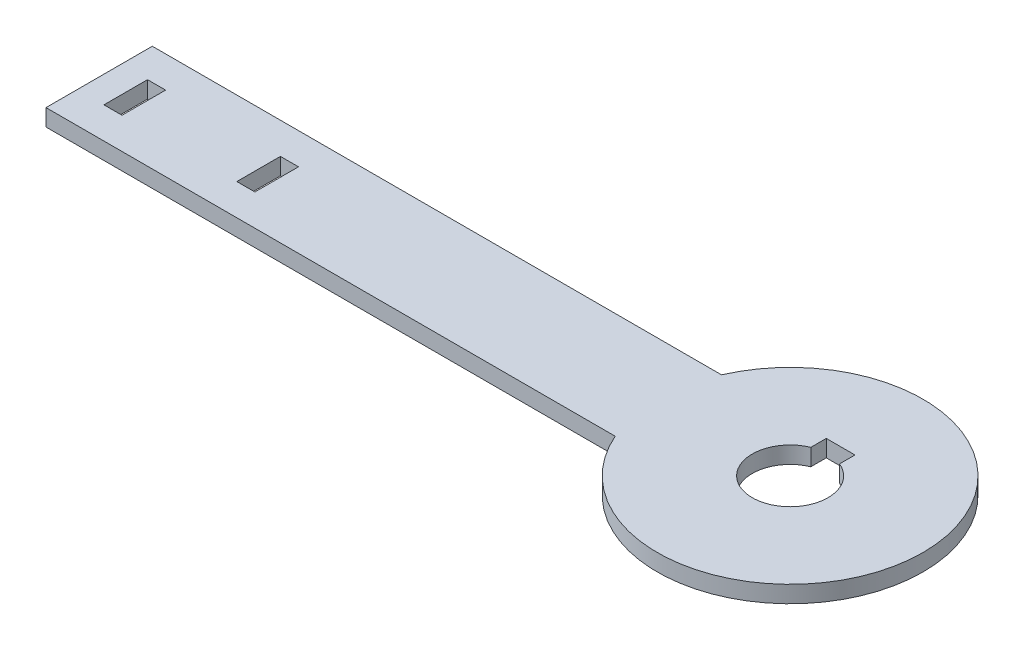
ISO-10303-21;
HEADER;
FILE_DESCRIPTION(('STEP AP214'),'2;1');
FILE_NAME('part.step','',(''),(''),'','','');
FILE_SCHEMA(('AUTOMOTIVE_DESIGN { 1 0 10303 214 1 1 1 1 }'));
ENDSEC;
DATA;
#1=APPLICATION_CONTEXT('core data for automotive mechanical design processes');
#2=APPLICATION_PROTOCOL_DEFINITION('international standard','automotive_design',2000,#1);
#3=PRODUCT_CONTEXT('',#1,'mechanical');
#4=PRODUCT('Part','Part','',(#3));
#5=PRODUCT_RELATED_PRODUCT_CATEGORY('part','',(#4));
#6=PRODUCT_DEFINITION_FORMATION('','',#4);
#7=PRODUCT_DEFINITION_CONTEXT('part definition',#1,'design');
#8=PRODUCT_DEFINITION('design','',#6,#7);
#9=PRODUCT_DEFINITION_SHAPE('','',#8);
#10=(LENGTH_UNIT() NAMED_UNIT(*) SI_UNIT(.MILLI.,.METRE.));
#11=(NAMED_UNIT(*) PLANE_ANGLE_UNIT() SI_UNIT($,.RADIAN.));
#12=(NAMED_UNIT(*) SI_UNIT($,.STERADIAN.) SOLID_ANGLE_UNIT());
#13=UNCERTAINTY_MEASURE_WITH_UNIT(LENGTH_MEASURE(1.E-05),#10,'distance_accuracy_value','');
#14=(GEOMETRIC_REPRESENTATION_CONTEXT(3) GLOBAL_UNCERTAINTY_ASSIGNED_CONTEXT((#13)) GLOBAL_UNIT_ASSIGNED_CONTEXT((#10,
#11,#12)) REPRESENTATION_CONTEXT('',''));
#15=CARTESIAN_POINT('',(0.,0.,0.));
#16=DIRECTION('',(0.,0.,1.));
#17=DIRECTION('',(1.,0.,0.));
#18=AXIS2_PLACEMENT_3D('',#15,#16,#17);
#19=CARTESIAN_POINT('',(0.,3.175,0.));
#20=DIRECTION('',(0.,-1.,0.));
#21=DIRECTION('',(0.,0.,-1.));
#22=AXIS2_PLACEMENT_3D('',#19,#20,#21);
#23=CYLINDRICAL_SURFACE('',#22,7.125);
#24=CARTESIAN_POINT('',(0.,0.,0.));
#25=DIRECTION('',(0.,1.,0.));
#26=DIRECTION('',(0.,0.,1.));
#27=AXIS2_PLACEMENT_3D('',#24,#25,#26);
#28=CIRCLE('',#27,7.125);
#29=CARTESIAN_POINT('',(-2.7,0.,-6.59360485622243));
#30=VERTEX_POINT('',#29);
#31=CARTESIAN_POINT('',(2.7,0.,-6.59360485622243));
#32=VERTEX_POINT('',#31);
#33=EDGE_CURVE('E250',#30,#32,#28,.T.);
#34=ORIENTED_EDGE('',*,*,#33,.F.);
#35=DIRECTION('',(0.,-1.,0.));
#36=VECTOR('',#35,1.);
#37=CARTESIAN_POINT('',(-2.7,3.175,-6.59360485622243));
#38=LINE('',#37,#36);
#39=CARTESIAN_POINT('',(-2.7,3.175,-6.59360485622243));
#40=VERTEX_POINT('',#39);
#41=EDGE_CURVE('E11',#40,#30,#38,.T.);
#42=ORIENTED_EDGE('',*,*,#41,.F.);
#43=CARTESIAN_POINT('',(0.,3.175,0.));
#44=DIRECTION('',(0.,1.,0.));
#45=DIRECTION('',(0.,0.,1.));
#46=AXIS2_PLACEMENT_3D('',#43,#44,#45);
#47=CIRCLE('',#46,7.125);
#48=CARTESIAN_POINT('',(2.7,3.175,-6.59360485622243));
#49=VERTEX_POINT('',#48);
#50=EDGE_CURVE('E170',#40,#49,#47,.T.);
#51=ORIENTED_EDGE('',*,*,#50,.T.);
#52=DIRECTION('',(0.,-1.,0.));
#53=VECTOR('',#52,1.);
#54=CARTESIAN_POINT('',(2.7,3.175,-6.59360485622243));
#55=LINE('',#54,#53);
#56=EDGE_CURVE('E111',#49,#32,#55,.T.);
#57=ORIENTED_EDGE('',*,*,#56,.T.);
#58=EDGE_LOOP('',(#34,#42,#51,#57));
#59=FACE_BOUND('',#58,.T.);
#60=ADVANCED_FACE('F34',(#59),#23,.F.);
#61=CARTESIAN_POINT('',(-2.7,3.175,0.));
#62=DIRECTION('',(-1.,0.,0.));
#63=DIRECTION('',(0.,0.,1.));
#64=AXIS2_PLACEMENT_3D('',#61,#62,#63);
#65=PLANE('',#64);
#66=DIRECTION('',(0.,0.,-1.));
#67=VECTOR('',#66,1.);
#68=CARTESIAN_POINT('',(-2.7,0.,0.));
#69=LINE('',#68,#67);
#70=CARTESIAN_POINT('',(-2.7,0.,-9.5));
#71=VERTEX_POINT('',#70);
#72=EDGE_CURVE('E175',#30,#71,#69,.T.);
#73=ORIENTED_EDGE('',*,*,#72,.T.);
#74=DIRECTION('',(0.,-1.,0.));
#75=VECTOR('',#74,1.);
#76=CARTESIAN_POINT('',(-2.7,3.175,-9.5));
#77=LINE('',#76,#75);
#78=CARTESIAN_POINT('',(-2.7,3.175,-9.5));
#79=VERTEX_POINT('',#78);
#80=EDGE_CURVE('E44',#79,#71,#77,.T.);
#81=ORIENTED_EDGE('',*,*,#80,.F.);
#82=DIRECTION('',(0.,0.,-1.));
#83=VECTOR('',#82,1.);
#84=CARTESIAN_POINT('',(-2.7,3.175,0.));
#85=LINE('',#84,#83);
#86=EDGE_CURVE('E166',#40,#79,#85,.T.);
#87=ORIENTED_EDGE('',*,*,#86,.F.);
#88=ORIENTED_EDGE('',*,*,#41,.T.);
#89=EDGE_LOOP('',(#73,#81,#87,#88));
#90=FACE_BOUND('',#89,.T.);
#91=ADVANCED_FACE('F173',(#90),#65,.F.);
#92=CARTESIAN_POINT('',(0.,3.175,-9.5));
#93=DIRECTION('',(0.,0.,-1.));
#94=DIRECTION('',(-1.,0.,0.));
#95=AXIS2_PLACEMENT_3D('',#92,#93,#94);
#96=PLANE('',#95);
#97=DIRECTION('',(1.,0.,0.));
#98=VECTOR('',#97,1.);
#99=CARTESIAN_POINT('',(0.,0.,-9.5));
#100=LINE('',#99,#98);
#101=CARTESIAN_POINT('',(2.7,0.,-9.5));
#102=VERTEX_POINT('',#101);
#103=EDGE_CURVE('E253',#71,#102,#100,.T.);
#104=ORIENTED_EDGE('',*,*,#103,.T.);
#105=DIRECTION('',(0.,-1.,0.));
#106=VECTOR('',#105,1.);
#107=CARTESIAN_POINT('',(2.7,3.175,-9.5));
#108=LINE('',#107,#106);
#109=CARTESIAN_POINT('',(2.7,3.175,-9.5));
#110=VERTEX_POINT('',#109);
#111=EDGE_CURVE('E165',#110,#102,#108,.T.);
#112=ORIENTED_EDGE('',*,*,#111,.F.);
#113=DIRECTION('',(1.,0.,0.));
#114=VECTOR('',#113,1.);
#115=CARTESIAN_POINT('',(0.,3.175,-9.5));
#116=LINE('',#115,#114);
#117=EDGE_CURVE('E159',#79,#110,#116,.T.);
#118=ORIENTED_EDGE('',*,*,#117,.F.);
#119=ORIENTED_EDGE('',*,*,#80,.T.);
#120=EDGE_LOOP('',(#104,#112,#118,#119));
#121=FACE_BOUND('',#120,.T.);
#122=ADVANCED_FACE('F162',(#121),#96,.F.);
#123=CARTESIAN_POINT('',(0.,3.175,-4.09999999999997));
#124=DIRECTION('',(0.,0.,1.));
#125=DIRECTION('',(1.,0.,0.));
#126=AXIS2_PLACEMENT_3D('',#123,#124,#125);
#127=PLANE('',#126);
#128=DIRECTION('',(-1.,0.,0.));
#129=VECTOR('',#128,1.);
#130=CARTESIAN_POINT('',(0.,0.,-4.09999999999997));
#131=LINE('',#130,#129);
#132=CARTESIAN_POINT('',(-96.6,0.,-4.09999999999999));
#133=VERTEX_POINT('',#132);
#134=CARTESIAN_POINT('',(-100.,0.,-4.09999999999999));
#135=VERTEX_POINT('',#134);
#136=EDGE_CURVE('E238',#133,#135,#131,.T.);
#137=ORIENTED_EDGE('',*,*,#136,.F.);
#138=DIRECTION('',(0.,-1.,0.));
#139=VECTOR('',#138,1.);
#140=CARTESIAN_POINT('',(-96.6,3.175,-4.09999999999999));
#141=LINE('',#140,#139);
#142=CARTESIAN_POINT('',(-96.6,3.175,-4.09999999999999));
#143=VERTEX_POINT('',#142);
#144=EDGE_CURVE('E187',#143,#133,#141,.T.);
#145=ORIENTED_EDGE('',*,*,#144,.F.);
#146=DIRECTION('',(-1.,0.,0.));
#147=VECTOR('',#146,1.);
#148=CARTESIAN_POINT('',(0.,3.175,-4.09999999999997));
#149=LINE('',#148,#147);
#150=CARTESIAN_POINT('',(-100.,3.175,-4.09999999999999));
#151=VERTEX_POINT('',#150);
#152=EDGE_CURVE('E275',#143,#151,#149,.T.);
#153=ORIENTED_EDGE('',*,*,#152,.T.);
#154=DIRECTION('',(0.,-1.,0.));
#155=VECTOR('',#154,1.);
#156=CARTESIAN_POINT('',(-100.,3.175,-4.09999999999999));
#157=LINE('',#156,#155);
#158=EDGE_CURVE('E180',#151,#135,#157,.T.);
#159=ORIENTED_EDGE('',*,*,#158,.T.);
#160=EDGE_LOOP('',(#137,#145,#153,#159));
#161=FACE_BOUND('',#160,.T.);
#162=ADVANCED_FACE('F319',(#161),#127,.T.);
#163=CARTESIAN_POINT('',(-96.6,3.175,0.));
#164=DIRECTION('',(-1.,0.,0.));
#165=DIRECTION('',(0.,0.,1.));
#166=AXIS2_PLACEMENT_3D('',#163,#164,#165);
#167=PLANE('',#166);
#168=DIRECTION('',(0.,0.,-1.));
#169=VECTOR('',#168,1.);
#170=CARTESIAN_POINT('',(-96.6,0.,0.));
#171=LINE('',#170,#169);
#172=CARTESIAN_POINT('',(-96.6,0.,4.10000000000001));
#173=VERTEX_POINT('',#172);
#174=EDGE_CURVE('E241',#173,#133,#171,.T.);
#175=ORIENTED_EDGE('',*,*,#174,.F.);
#176=DIRECTION('',(0.,-1.,0.));
#177=VECTOR('',#176,1.);
#178=CARTESIAN_POINT('',(-96.6,3.175,4.10000000000001));
#179=LINE('',#178,#177);
#180=CARTESIAN_POINT('',(-96.6,3.175,4.10000000000001));
#181=VERTEX_POINT('',#180);
#182=EDGE_CURVE('E185',#181,#173,#179,.T.);
#183=ORIENTED_EDGE('',*,*,#182,.F.);
#184=DIRECTION('',(0.,0.,-1.));
#185=VECTOR('',#184,1.);
#186=CARTESIAN_POINT('',(-96.6,3.175,0.));
#187=LINE('',#186,#185);
#188=EDGE_CURVE('E278',#181,#143,#187,.T.);
#189=ORIENTED_EDGE('',*,*,#188,.T.);
#190=ORIENTED_EDGE('',*,*,#144,.T.);
#191=EDGE_LOOP('',(#175,#183,#189,#190));
#192=FACE_BOUND('',#191,.T.);
#193=ADVANCED_FACE('F315',(#192),#167,.T.);
#194=CARTESIAN_POINT('',(0.,3.175,4.09999999999993));
#195=DIRECTION('',(0.,0.,-1.));
#196=DIRECTION('',(-1.,0.,0.));
#197=AXIS2_PLACEMENT_3D('',#194,#195,#196);
#198=PLANE('',#197);
#199=DIRECTION('',(1.,0.,0.));
#200=VECTOR('',#199,1.);
#201=CARTESIAN_POINT('',(0.,0.,4.09999999999993));
#202=LINE('',#201,#200);
#203=CARTESIAN_POINT('',(-100.,0.,4.10000000000001));
#204=VERTEX_POINT('',#203);
#205=EDGE_CURVE('E244',#204,#173,#202,.T.);
#206=ORIENTED_EDGE('',*,*,#205,.F.);
#207=DIRECTION('',(0.,-1.,0.));
#208=VECTOR('',#207,1.);
#209=CARTESIAN_POINT('',(-100.,3.175,4.10000000000001));
#210=LINE('',#209,#208);
#211=CARTESIAN_POINT('',(-100.,3.175,4.10000000000001));
#212=VERTEX_POINT('',#211);
#213=EDGE_CURVE('E182',#212,#204,#210,.T.);
#214=ORIENTED_EDGE('',*,*,#213,.F.);
#215=DIRECTION('',(1.,0.,0.));
#216=VECTOR('',#215,1.);
#217=CARTESIAN_POINT('',(0.,3.175,4.09999999999993));
#218=LINE('',#217,#216);
#219=EDGE_CURVE('E281',#212,#181,#218,.T.);
#220=ORIENTED_EDGE('',*,*,#219,.T.);
#221=ORIENTED_EDGE('',*,*,#182,.T.);
#222=EDGE_LOOP('',(#206,#214,#220,#221));
#223=FACE_BOUND('',#222,.T.);
#224=ADVANCED_FACE('F311',(#223),#198,.T.);
#225=CARTESIAN_POINT('',(-121.6,3.175,0.));
#226=DIRECTION('',(1.,0.,0.));
#227=DIRECTION('',(0.,0.,-1.));
#228=AXIS2_PLACEMENT_3D('',#225,#226,#227);
#229=PLANE('',#228);
#230=DIRECTION('',(0.,0.,1.));
#231=VECTOR('',#230,1.);
#232=CARTESIAN_POINT('',(-121.6,0.,0.));
#233=LINE('',#232,#231);
#234=CARTESIAN_POINT('',(-121.6,0.,-4.09999999999999));
#235=VERTEX_POINT('',#234);
#236=CARTESIAN_POINT('',(-121.6,0.,4.10000000000001));
#237=VERTEX_POINT('',#236);
#238=EDGE_CURVE('E227',#235,#237,#233,.T.);
#239=ORIENTED_EDGE('',*,*,#238,.T.);
#240=DIRECTION('',(0.,-1.,0.));
#241=VECTOR('',#240,1.);
#242=CARTESIAN_POINT('',(-121.6,3.175,4.10000000000001));
#243=LINE('',#242,#241);
#244=CARTESIAN_POINT('',(-121.6,3.175,4.10000000000001));
#245=VERTEX_POINT('',#244);
#246=EDGE_CURVE('E183',#245,#237,#243,.T.);
#247=ORIENTED_EDGE('',*,*,#246,.F.);
#248=DIRECTION('',(0.,0.,1.));
#249=VECTOR('',#248,1.);
#250=CARTESIAN_POINT('',(-121.6,3.175,0.));
#251=LINE('',#250,#249);
#252=CARTESIAN_POINT('',(-121.6,3.175,-4.09999999999999));
#253=VERTEX_POINT('',#252);
#254=EDGE_CURVE('E265',#253,#245,#251,.T.);
#255=ORIENTED_EDGE('',*,*,#254,.F.);
#256=DIRECTION('',(0.,-1.,0.));
#257=VECTOR('',#256,1.);
#258=CARTESIAN_POINT('',(-121.6,3.175,-4.09999999999999));
#259=LINE('',#258,#257);
#260=EDGE_CURVE('E189',#253,#235,#259,.T.);
#261=ORIENTED_EDGE('',*,*,#260,.T.);
#262=EDGE_LOOP('',(#239,#247,#255,#261));
#263=FACE_BOUND('',#262,.T.);
#264=ADVANCED_FACE('F314',(#263),#229,.F.);
#265=CARTESIAN_POINT('',(0.,3.175,4.10000000000004));
#266=DIRECTION('',(0.,0.,1.));
#267=DIRECTION('',(1.,0.,0.));
#268=AXIS2_PLACEMENT_3D('',#265,#266,#267);
#269=PLANE('',#268);
#270=DIRECTION('',(-1.,0.,0.));
#271=VECTOR('',#270,1.);
#272=CARTESIAN_POINT('',(0.,0.,4.10000000000004));
#273=LINE('',#272,#271);
#274=CARTESIAN_POINT('',(-125.,0.,4.10000000000001));
#275=VERTEX_POINT('',#274);
#276=EDGE_CURVE('E230',#237,#275,#273,.T.);
#277=ORIENTED_EDGE('',*,*,#276,.T.);
#278=DIRECTION('',(0.,-1.,0.));
#279=VECTOR('',#278,1.);
#280=CARTESIAN_POINT('',(-125.,3.175,4.10000000000001));
#281=LINE('',#280,#279);
#282=CARTESIAN_POINT('',(-125.,3.175,4.10000000000001));
#283=VERTEX_POINT('',#282);
#284=EDGE_CURVE('E194',#283,#275,#281,.T.);
#285=ORIENTED_EDGE('',*,*,#284,.F.);
#286=DIRECTION('',(-1.,0.,0.));
#287=VECTOR('',#286,1.);
#288=CARTESIAN_POINT('',(0.,3.175,4.10000000000004));
#289=LINE('',#288,#287);
#290=EDGE_CURVE('E268',#245,#283,#289,.T.);
#291=ORIENTED_EDGE('',*,*,#290,.F.);
#292=ORIENTED_EDGE('',*,*,#246,.T.);
#293=EDGE_LOOP('',(#277,#285,#291,#292));
#294=FACE_BOUND('',#293,.T.);
#295=ADVANCED_FACE('F331',(#294),#269,.F.);
#296=CARTESIAN_POINT('',(-125.,3.175,0.));
#297=DIRECTION('',(1.,0.,0.));
#298=DIRECTION('',(0.,0.,-1.));
#299=AXIS2_PLACEMENT_3D('',#296,#297,#298);
#300=PLANE('',#299);
#301=DIRECTION('',(0.,0.,1.));
#302=VECTOR('',#301,1.);
#303=CARTESIAN_POINT('',(-125.,0.,0.));
#304=LINE('',#303,#302);
#305=CARTESIAN_POINT('',(-125.,0.,-4.09999999999999));
#306=VERTEX_POINT('',#305);
#307=EDGE_CURVE('E233',#306,#275,#304,.T.);
#308=ORIENTED_EDGE('',*,*,#307,.F.);
#309=DIRECTION('',(0.,-1.,0.));
#310=VECTOR('',#309,1.);
#311=CARTESIAN_POINT('',(-125.,3.175,-4.09999999999999));
#312=LINE('',#311,#310);
#313=CARTESIAN_POINT('',(-125.,3.175,-4.09999999999999));
#314=VERTEX_POINT('',#313);
#315=EDGE_CURVE('E192',#314,#306,#312,.T.);
#316=ORIENTED_EDGE('',*,*,#315,.F.);
#317=DIRECTION('',(0.,0.,1.));
#318=VECTOR('',#317,1.);
#319=CARTESIAN_POINT('',(-125.,3.175,0.));
#320=LINE('',#319,#318);
#321=EDGE_CURVE('E270',#314,#283,#320,.T.);
#322=ORIENTED_EDGE('',*,*,#321,.T.);
#323=ORIENTED_EDGE('',*,*,#284,.T.);
#324=EDGE_LOOP('',(#308,#316,#322,#323));
#325=FACE_BOUND('',#324,.T.);
#326=ADVANCED_FACE('F328',(#325),#300,.T.);
#327=CARTESIAN_POINT('',(0.,3.175,10.));
#328=DIRECTION('',(0.,0.,-1.));
#329=DIRECTION('',(-1.,0.,0.));
#330=AXIS2_PLACEMENT_3D('',#327,#328,#329);
#331=PLANE('',#330);
#332=DIRECTION('',(1.,0.,0.));
#333=VECTOR('',#332,1.);
#334=CARTESIAN_POINT('',(0.,0.,10.));
#335=LINE('',#334,#333);
#336=CARTESIAN_POINT('',(-130.,0.,10.));
#337=VERTEX_POINT('',#336);
#338=CARTESIAN_POINT('',(-22.9128784747792,0.,10.));
#339=VERTEX_POINT('',#338);
#340=EDGE_CURVE('E215',#337,#339,#335,.T.);
#341=ORIENTED_EDGE('',*,*,#340,.T.);
#342=DIRECTION('',(0.,-1.,0.));
#343=VECTOR('',#342,1.);
#344=CARTESIAN_POINT('',(-22.9128784747792,3.175,10.));
#345=LINE('',#344,#343);
#346=CARTESIAN_POINT('',(-22.9128784747792,3.175,10.));
#347=VERTEX_POINT('',#346);
#348=EDGE_CURVE('E38',#347,#339,#345,.T.);
#349=ORIENTED_EDGE('',*,*,#348,.F.);
#350=DIRECTION('',(1.,0.,0.));
#351=VECTOR('',#350,1.);
#352=CARTESIAN_POINT('',(0.,3.175,10.));
#353=LINE('',#352,#351);
#354=CARTESIAN_POINT('',(-130.,3.175,10.));
#355=VERTEX_POINT('',#354);
#356=EDGE_CURVE('E255',#355,#347,#353,.T.);
#357=ORIENTED_EDGE('',*,*,#356,.F.);
#358=DIRECTION('',(0.,-1.,0.));
#359=VECTOR('',#358,1.);
#360=CARTESIAN_POINT('',(-130.,3.175,10.));
#361=LINE('',#360,#359);
#362=EDGE_CURVE('E198',#355,#337,#361,.T.);
#363=ORIENTED_EDGE('',*,*,#362,.T.);
#364=EDGE_LOOP('',(#341,#349,#357,#363));
#365=FACE_BOUND('',#364,.T.);
#366=ADVANCED_FACE('F36',(#365),#331,.F.);
#367=CARTESIAN_POINT('',(0.,3.175,0.));
#368=DIRECTION('',(0.,-1.,0.));
#369=DIRECTION('',(0.,0.,-1.));
#370=AXIS2_PLACEMENT_3D('',#367,#368,#369);
#371=CYLINDRICAL_SURFACE('',#370,25.);
#372=CARTESIAN_POINT('',(0.,0.,0.));
#373=DIRECTION('',(0.,1.,0.));
#374=DIRECTION('',(0.,0.,1.));
#375=AXIS2_PLACEMENT_3D('',#372,#373,#374);
#376=CIRCLE('',#375,25.);
#377=CARTESIAN_POINT('',(-22.9128784747792,0.,-10.));
#378=VERTEX_POINT('',#377);
#379=EDGE_CURVE('E211',#339,#378,#376,.T.);
#380=ORIENTED_EDGE('',*,*,#379,.T.);
#381=DIRECTION('',(0.,-1.,0.));
#382=VECTOR('',#381,1.);
#383=CARTESIAN_POINT('',(-22.9128784747792,3.175,-10.));
#384=LINE('',#383,#382);
#385=CARTESIAN_POINT('',(-22.9128784747792,3.175,-10.));
#386=VERTEX_POINT('',#385);
#387=EDGE_CURVE('E203',#386,#378,#384,.T.);
#388=ORIENTED_EDGE('',*,*,#387,.F.);
#389=CARTESIAN_POINT('',(0.,3.175,0.));
#390=DIRECTION('',(0.,1.,0.));
#391=DIRECTION('',(0.,0.,1.));
#392=AXIS2_PLACEMENT_3D('',#389,#390,#391);
#393=CIRCLE('',#392,25.);
#394=EDGE_CURVE('E119',#347,#386,#393,.T.);
#395=ORIENTED_EDGE('',*,*,#394,.F.);
#396=ORIENTED_EDGE('',*,*,#348,.T.);
#397=EDGE_LOOP('',(#380,#388,#395,#396));
#398=FACE_BOUND('',#397,.T.);
#399=ADVANCED_FACE('F210',(#398),#371,.T.);
#400=CARTESIAN_POINT('',(0.,3.175,-10.));
#401=DIRECTION('',(0.,0.,1.));
#402=DIRECTION('',(1.,0.,0.));
#403=AXIS2_PLACEMENT_3D('',#400,#401,#402);
#404=PLANE('',#403);
#405=DIRECTION('',(-1.,0.,0.));
#406=VECTOR('',#405,1.);
#407=CARTESIAN_POINT('',(0.,0.,-10.));
#408=LINE('',#407,#406);
#409=CARTESIAN_POINT('',(-130.,0.,-9.99999999999998));
#410=VERTEX_POINT('',#409);
#411=EDGE_CURVE('E220',#378,#410,#408,.T.);
#412=ORIENTED_EDGE('',*,*,#411,.T.);
#413=DIRECTION('',(0.,-1.,0.));
#414=VECTOR('',#413,1.);
#415=CARTESIAN_POINT('',(-130.,3.175,-9.99999999999998));
#416=LINE('',#415,#414);
#417=CARTESIAN_POINT('',(-130.,3.175,-9.99999999999998));
#418=VERTEX_POINT('',#417);
#419=EDGE_CURVE('E201',#418,#410,#416,.T.);
#420=ORIENTED_EDGE('',*,*,#419,.F.);
#421=DIRECTION('',(-1.,0.,0.));
#422=VECTOR('',#421,1.);
#423=CARTESIAN_POINT('',(0.,3.175,-10.));
#424=LINE('',#423,#422);
#425=EDGE_CURVE('E259',#386,#418,#424,.T.);
#426=ORIENTED_EDGE('',*,*,#425,.F.);
#427=ORIENTED_EDGE('',*,*,#387,.T.);
#428=EDGE_LOOP('',(#412,#420,#426,#427));
#429=FACE_BOUND('',#428,.T.);
#430=ADVANCED_FACE('F309',(#429),#404,.F.);
#431=CARTESIAN_POINT('',(-100.,3.175,0.));
#432=DIRECTION('',(1.,0.,0.));
#433=DIRECTION('',(0.,0.,-1.));
#434=AXIS2_PLACEMENT_3D('',#431,#432,#433);
#435=PLANE('',#434);
#436=DIRECTION('',(0.,0.,1.));
#437=VECTOR('',#436,1.);
#438=CARTESIAN_POINT('',(-100.,0.,0.));
#439=LINE('',#438,#437);
#440=EDGE_CURVE('E247',#135,#204,#439,.T.);
#441=ORIENTED_EDGE('',*,*,#440,.F.);
#442=ORIENTED_EDGE('',*,*,#158,.F.);
#443=DIRECTION('',(0.,0.,1.));
#444=VECTOR('',#443,1.);
#445=CARTESIAN_POINT('',(-100.,3.175,0.));
#446=LINE('',#445,#444);
#447=EDGE_CURVE('E284',#151,#212,#446,.T.);
#448=ORIENTED_EDGE('',*,*,#447,.T.);
#449=ORIENTED_EDGE('',*,*,#213,.T.);
#450=EDGE_LOOP('',(#441,#442,#448,#449));
#451=FACE_BOUND('',#450,.T.);
#452=ADVANCED_FACE('F305',(#451),#435,.T.);
#453=CARTESIAN_POINT('',(0.,3.175,-4.10000000000002));
#454=DIRECTION('',(0.,0.,-1.));
#455=DIRECTION('',(-1.,0.,0.));
#456=AXIS2_PLACEMENT_3D('',#453,#454,#455);
#457=PLANE('',#456);
#458=DIRECTION('',(1.,0.,0.));
#459=VECTOR('',#458,1.);
#460=CARTESIAN_POINT('',(0.,0.,-4.10000000000002));
#461=LINE('',#460,#459);
#462=EDGE_CURVE('E236',#306,#235,#461,.T.);
#463=ORIENTED_EDGE('',*,*,#462,.T.);
#464=ORIENTED_EDGE('',*,*,#260,.F.);
#465=DIRECTION('',(1.,0.,0.));
#466=VECTOR('',#465,1.);
#467=CARTESIAN_POINT('',(0.,3.175,-4.10000000000002));
#468=LINE('',#467,#466);
#469=EDGE_CURVE('E273',#314,#253,#468,.T.);
#470=ORIENTED_EDGE('',*,*,#469,.F.);
#471=ORIENTED_EDGE('',*,*,#315,.T.);
#472=EDGE_LOOP('',(#463,#464,#470,#471));
#473=FACE_BOUND('',#472,.T.);
#474=ADVANCED_FACE('F308',(#473),#457,.F.);
#475=CARTESIAN_POINT('',(-130.,3.175,0.));
#476=DIRECTION('',(1.,0.,0.));
#477=DIRECTION('',(0.,0.,-1.));
#478=AXIS2_PLACEMENT_3D('',#475,#476,#477);
#479=PLANE('',#478);
#480=DIRECTION('',(0.,0.,1.));
#481=VECTOR('',#480,1.);
#482=CARTESIAN_POINT('',(-130.,0.,0.));
#483=LINE('',#482,#481);
#484=EDGE_CURVE('E225',#410,#337,#483,.T.);
#485=ORIENTED_EDGE('',*,*,#484,.T.);
#486=ORIENTED_EDGE('',*,*,#362,.F.);
#487=DIRECTION('',(0.,0.,1.));
#488=VECTOR('',#487,1.);
#489=CARTESIAN_POINT('',(-130.,3.175,0.));
#490=LINE('',#489,#488);
#491=EDGE_CURVE('E263',#418,#355,#490,.T.);
#492=ORIENTED_EDGE('',*,*,#491,.F.);
#493=ORIENTED_EDGE('',*,*,#419,.T.);
#494=EDGE_LOOP('',(#485,#486,#492,#493));
#495=FACE_BOUND('',#494,.T.);
#496=ADVANCED_FACE('F326',(#495),#479,.F.);
#497=CARTESIAN_POINT('',(2.7,3.175,0.));
#498=DIRECTION('',(1.,0.,0.));
#499=DIRECTION('',(0.,0.,-1.));
#500=AXIS2_PLACEMENT_3D('',#497,#498,#499);
#501=PLANE('',#500);
#502=DIRECTION('',(0.,0.,1.));
#503=VECTOR('',#502,1.);
#504=CARTESIAN_POINT('',(2.7,0.,0.));
#505=LINE('',#504,#503);
#506=EDGE_CURVE('E104',#102,#32,#505,.T.);
#507=ORIENTED_EDGE('',*,*,#506,.T.);
#508=ORIENTED_EDGE('',*,*,#56,.F.);
#509=DIRECTION('',(0.,0.,1.));
#510=VECTOR('',#509,1.);
#511=CARTESIAN_POINT('',(2.7,3.175,0.));
#512=LINE('',#511,#510);
#513=EDGE_CURVE('E53',#110,#49,#512,.T.);
#514=ORIENTED_EDGE('',*,*,#513,.F.);
#515=ORIENTED_EDGE('',*,*,#111,.T.);
#516=EDGE_LOOP('',(#507,#508,#514,#515));
#517=FACE_BOUND('',#516,.T.);
#518=ADVANCED_FACE('F293',(#517),#501,.F.);
#519=CARTESIAN_POINT('',(0.,3.175,0.));
#520=DIRECTION('',(0.,1.,0.));
#521=DIRECTION('',(0.,0.,1.));
#522=AXIS2_PLACEMENT_3D('',#519,#520,#521);
#523=PLANE('',#522);
#524=ORIENTED_EDGE('',*,*,#356,.T.);
#525=ORIENTED_EDGE('',*,*,#394,.T.);
#526=ORIENTED_EDGE('',*,*,#425,.T.);
#527=ORIENTED_EDGE('',*,*,#491,.T.);
#528=EDGE_LOOP('',(#524,#525,#526,#527));
#529=FACE_BOUND('',#528,.T.);
#530=ORIENTED_EDGE('',*,*,#254,.T.);
#531=ORIENTED_EDGE('',*,*,#290,.T.);
#532=ORIENTED_EDGE('',*,*,#321,.F.);
#533=ORIENTED_EDGE('',*,*,#469,.T.);
#534=EDGE_LOOP('',(#530,#531,#532,#533));
#535=FACE_BOUND('',#534,.T.);
#536=ORIENTED_EDGE('',*,*,#152,.F.);
#537=ORIENTED_EDGE('',*,*,#188,.F.);
#538=ORIENTED_EDGE('',*,*,#219,.F.);
#539=ORIENTED_EDGE('',*,*,#447,.F.);
#540=EDGE_LOOP('',(#536,#537,#538,#539));
#541=FACE_BOUND('',#540,.T.);
#542=ORIENTED_EDGE('',*,*,#50,.F.);
#543=ORIENTED_EDGE('',*,*,#86,.T.);
#544=ORIENTED_EDGE('',*,*,#117,.T.);
#545=ORIENTED_EDGE('',*,*,#513,.T.);
#546=EDGE_LOOP('',(#542,#543,#544,#545));
#547=FACE_BOUND('',#546,.T.);
#548=ADVANCED_FACE('F169',(#529,#535,#541,#547),#523,.T.);
#549=CARTESIAN_POINT('',(0.,0.,0.));
#550=DIRECTION('',(0.,1.,0.));
#551=DIRECTION('',(0.,0.,1.));
#552=AXIS2_PLACEMENT_3D('',#549,#550,#551);
#553=PLANE('',#552);
#554=ORIENTED_EDGE('',*,*,#340,.F.);
#555=ORIENTED_EDGE('',*,*,#484,.F.);
#556=ORIENTED_EDGE('',*,*,#411,.F.);
#557=ORIENTED_EDGE('',*,*,#379,.F.);
#558=EDGE_LOOP('',(#554,#555,#556,#557));
#559=FACE_BOUND('',#558,.T.);
#560=ORIENTED_EDGE('',*,*,#238,.F.);
#561=ORIENTED_EDGE('',*,*,#462,.F.);
#562=ORIENTED_EDGE('',*,*,#307,.T.);
#563=ORIENTED_EDGE('',*,*,#276,.F.);
#564=EDGE_LOOP('',(#560,#561,#562,#563));
#565=FACE_BOUND('',#564,.T.);
#566=ORIENTED_EDGE('',*,*,#136,.T.);
#567=ORIENTED_EDGE('',*,*,#440,.T.);
#568=ORIENTED_EDGE('',*,*,#205,.T.);
#569=ORIENTED_EDGE('',*,*,#174,.T.);
#570=EDGE_LOOP('',(#566,#567,#568,#569));
#571=FACE_BOUND('',#570,.T.);
#572=ORIENTED_EDGE('',*,*,#33,.T.);
#573=ORIENTED_EDGE('',*,*,#506,.F.);
#574=ORIENTED_EDGE('',*,*,#103,.F.);
#575=ORIENTED_EDGE('',*,*,#72,.F.);
#576=EDGE_LOOP('',(#572,#573,#574,#575));
#577=FACE_BOUND('',#576,.T.);
#578=ADVANCED_FACE('F287',(#559,#565,#571,#577),#553,.F.);
#579=CLOSED_SHELL('',(#60,#91,#122,#162,#193,#224,#264,#295,#326,#366,#399,#430,#452,#474,#496,
#518,#548,#578));
#580=MANIFOLD_SOLID_BREP('B2',#579);
#581=ADVANCED_BREP_SHAPE_REPRESENTATION('',(#18,#580),#14);
#582=SHAPE_DEFINITION_REPRESENTATION(#9,#581);
ENDSEC;
END-ISO-10303-21;
